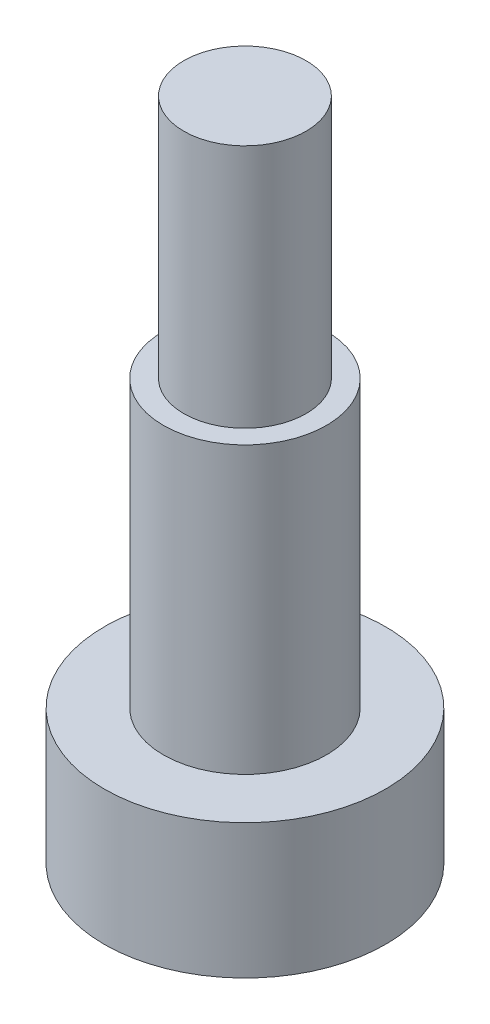
ISO-10303-21;
HEADER;
FILE_DESCRIPTION(('STEP AP214'),'2;1');
FILE_NAME('part.step','',(''),(''),'','','');
FILE_SCHEMA(('AUTOMOTIVE_DESIGN { 1 0 10303 214 1 1 1 1 }'));
ENDSEC;
DATA;
#1=APPLICATION_CONTEXT('core data for automotive mechanical design processes');
#2=APPLICATION_PROTOCOL_DEFINITION('international standard','automotive_design',2000,#1);
#3=PRODUCT_CONTEXT('',#1,'mechanical');
#4=PRODUCT('Part','Part','',(#3));
#5=PRODUCT_RELATED_PRODUCT_CATEGORY('part','',(#4));
#6=PRODUCT_DEFINITION_FORMATION('','',#4);
#7=PRODUCT_DEFINITION_CONTEXT('part definition',#1,'design');
#8=PRODUCT_DEFINITION('design','',#6,#7);
#9=PRODUCT_DEFINITION_SHAPE('','',#8);
#10=(LENGTH_UNIT() NAMED_UNIT(*) SI_UNIT(.MILLI.,.METRE.));
#11=(NAMED_UNIT(*) PLANE_ANGLE_UNIT() SI_UNIT($,.RADIAN.));
#12=(NAMED_UNIT(*) SI_UNIT($,.STERADIAN.) SOLID_ANGLE_UNIT());
#13=UNCERTAINTY_MEASURE_WITH_UNIT(LENGTH_MEASURE(1.E-05),#10,'distance_accuracy_value','');
#14=(GEOMETRIC_REPRESENTATION_CONTEXT(3) GLOBAL_UNCERTAINTY_ASSIGNED_CONTEXT((#13)) GLOBAL_UNIT_ASSIGNED_CONTEXT((#10,
#11,#12)) REPRESENTATION_CONTEXT('',''));
#15=CARTESIAN_POINT('',(0.,0.,0.));
#16=DIRECTION('',(0.,0.,1.));
#17=DIRECTION('',(1.,0.,0.));
#18=AXIS2_PLACEMENT_3D('',#15,#16,#17);
#19=CARTESIAN_POINT('',(0.,3.3,0.));
#20=DIRECTION('',(0.,-1.,0.));
#21=DIRECTION('',(0.,0.,-1.));
#22=AXIS2_PLACEMENT_3D('',#19,#20,#21);
#23=CYLINDRICAL_SURFACE('',#22,3.45);
#24=CARTESIAN_POINT('',(0.,3.3,0.));
#25=DIRECTION('',(0.,1.,0.));
#26=DIRECTION('',(0.,0.,1.));
#27=AXIS2_PLACEMENT_3D('',#24,#25,#26);
#28=CIRCLE('',#27,3.45);
#29=CARTESIAN_POINT('',(0.,3.3,3.45));
#30=VERTEX_POINT('',#29);
#31=EDGE_CURVE('E59',#30,#30,#28,.T.);
#32=ORIENTED_EDGE('',*,*,#31,.F.);
#33=EDGE_LOOP('',(#32));
#34=FACE_BOUND('',#33,.T.);
#35=CARTESIAN_POINT('',(0.,0.,0.));
#36=DIRECTION('',(0.,1.,0.));
#37=DIRECTION('',(0.,0.,1.));
#38=AXIS2_PLACEMENT_3D('',#35,#36,#37);
#39=CIRCLE('',#38,3.45);
#40=CARTESIAN_POINT('',(0.,0.,3.45));
#41=VERTEX_POINT('',#40);
#42=EDGE_CURVE('E47',#41,#41,#39,.T.);
#43=ORIENTED_EDGE('',*,*,#42,.T.);
#44=EDGE_LOOP('',(#43));
#45=FACE_BOUND('',#44,.T.);
#46=ADVANCED_FACE('F44',(#34,#45),#23,.T.);
#47=CARTESIAN_POINT('',(0.,3.3,0.));
#48=DIRECTION('',(0.,1.,0.));
#49=DIRECTION('',(0.,0.,1.));
#50=AXIS2_PLACEMENT_3D('',#47,#48,#49);
#51=PLANE('',#50);
#52=CARTESIAN_POINT('',(0.,3.3,0.));
#53=DIRECTION('',(0.,1.,0.));
#54=DIRECTION('',(0.,0.,1.));
#55=AXIS2_PLACEMENT_3D('',#52,#53,#54);
#56=CIRCLE('',#55,2.);
#57=CARTESIAN_POINT('',(0.,3.3,2.));
#58=VERTEX_POINT('',#57);
#59=EDGE_CURVE('E52',#58,#58,#56,.T.);
#60=ORIENTED_EDGE('',*,*,#59,.F.);
#61=EDGE_LOOP('',(#60));
#62=FACE_BOUND('',#61,.T.);
#63=ORIENTED_EDGE('',*,*,#31,.T.);
#64=EDGE_LOOP('',(#63));
#65=FACE_BOUND('',#64,.T.);
#66=ADVANCED_FACE('F79',(#62,#65),#51,.T.);
#67=CARTESIAN_POINT('',(0.,0.,0.));
#68=DIRECTION('',(0.,1.,0.));
#69=DIRECTION('',(0.,0.,1.));
#70=AXIS2_PLACEMENT_3D('',#67,#68,#69);
#71=PLANE('',#70);
#72=ORIENTED_EDGE('',*,*,#42,.F.);
#73=EDGE_LOOP('',(#72));
#74=FACE_BOUND('',#73,.T.);
#75=ADVANCED_FACE('F76',(#74),#71,.F.);
#76=CARTESIAN_POINT('',(0.,10.3,0.));
#77=DIRECTION('',(0.,-1.,0.));
#78=DIRECTION('',(0.,0.,-1.));
#79=AXIS2_PLACEMENT_3D('',#76,#77,#78);
#80=CYLINDRICAL_SURFACE('',#79,2.);
#81=CARTESIAN_POINT('',(0.,10.3,0.));
#82=DIRECTION('',(0.,1.,0.));
#83=DIRECTION('',(0.,0.,1.));
#84=AXIS2_PLACEMENT_3D('',#81,#82,#83);
#85=CIRCLE('',#84,2.);
#86=CARTESIAN_POINT('',(0.,10.3,2.));
#87=VERTEX_POINT('',#86);
#88=EDGE_CURVE('E64',#87,#87,#85,.T.);
#89=ORIENTED_EDGE('',*,*,#88,.F.);
#90=EDGE_LOOP('',(#89));
#91=FACE_BOUND('',#90,.T.);
#92=ORIENTED_EDGE('',*,*,#59,.T.);
#93=EDGE_LOOP('',(#92));
#94=FACE_BOUND('',#93,.T.);
#95=ADVANCED_FACE('F78',(#91,#94),#80,.T.);
#96=CARTESIAN_POINT('',(0.,10.3,0.));
#97=DIRECTION('',(0.,1.,0.));
#98=DIRECTION('',(0.,0.,1.));
#99=AXIS2_PLACEMENT_3D('',#96,#97,#98);
#100=PLANE('',#99);
#101=CARTESIAN_POINT('',(0.,10.3,0.));
#102=DIRECTION('',(0.,1.,0.));
#103=DIRECTION('',(0.,0.,1.));
#104=AXIS2_PLACEMENT_3D('',#101,#102,#103);
#105=CIRCLE('',#104,1.5);
#106=CARTESIAN_POINT('',(0.,10.3,1.5));
#107=VERTEX_POINT('',#106);
#108=EDGE_CURVE('E10',#107,#107,#105,.T.);
#109=ORIENTED_EDGE('',*,*,#108,.F.);
#110=EDGE_LOOP('',(#109));
#111=FACE_BOUND('',#110,.T.);
#112=ORIENTED_EDGE('',*,*,#88,.T.);
#113=EDGE_LOOP('',(#112));
#114=FACE_BOUND('',#113,.T.);
#115=ADVANCED_FACE('F84',(#111,#114),#100,.T.);
#116=CARTESIAN_POINT('',(0.,16.3,0.));
#117=DIRECTION('',(0.,-1.,0.));
#118=DIRECTION('',(0.,0.,-1.));
#119=AXIS2_PLACEMENT_3D('',#116,#117,#118);
#120=CYLINDRICAL_SURFACE('',#119,1.5);
#121=CARTESIAN_POINT('',(0.,16.3,0.));
#122=DIRECTION('',(0.,1.,0.));
#123=DIRECTION('',(0.,0.,1.));
#124=AXIS2_PLACEMENT_3D('',#121,#122,#123);
#125=CIRCLE('',#124,1.5);
#126=CARTESIAN_POINT('',(0.,16.3,1.5));
#127=VERTEX_POINT('',#126);
#128=EDGE_CURVE('E63',#127,#127,#125,.T.);
#129=ORIENTED_EDGE('',*,*,#128,.F.);
#130=EDGE_LOOP('',(#129));
#131=FACE_BOUND('',#130,.T.);
#132=ORIENTED_EDGE('',*,*,#108,.T.);
#133=EDGE_LOOP('',(#132));
#134=FACE_BOUND('',#133,.T.);
#135=ADVANCED_FACE('F111',(#131,#134),#120,.T.);
#136=CARTESIAN_POINT('',(0.,16.3,0.));
#137=DIRECTION('',(0.,1.,0.));
#138=DIRECTION('',(0.,0.,1.));
#139=AXIS2_PLACEMENT_3D('',#136,#137,#138);
#140=PLANE('',#139);
#141=ORIENTED_EDGE('',*,*,#128,.T.);
#142=EDGE_LOOP('',(#141));
#143=FACE_BOUND('',#142,.T.);
#144=ADVANCED_FACE('F120',(#143),#140,.T.);
#145=CLOSED_SHELL('',(#46,#66,#75,#95,#115,#135,#144));
#146=MANIFOLD_SOLID_BREP('B2',#145);
#147=ADVANCED_BREP_SHAPE_REPRESENTATION('',(#18,#146),#14);
#148=SHAPE_DEFINITION_REPRESENTATION(#9,#147);
ENDSEC;
END-ISO-10303-21;
